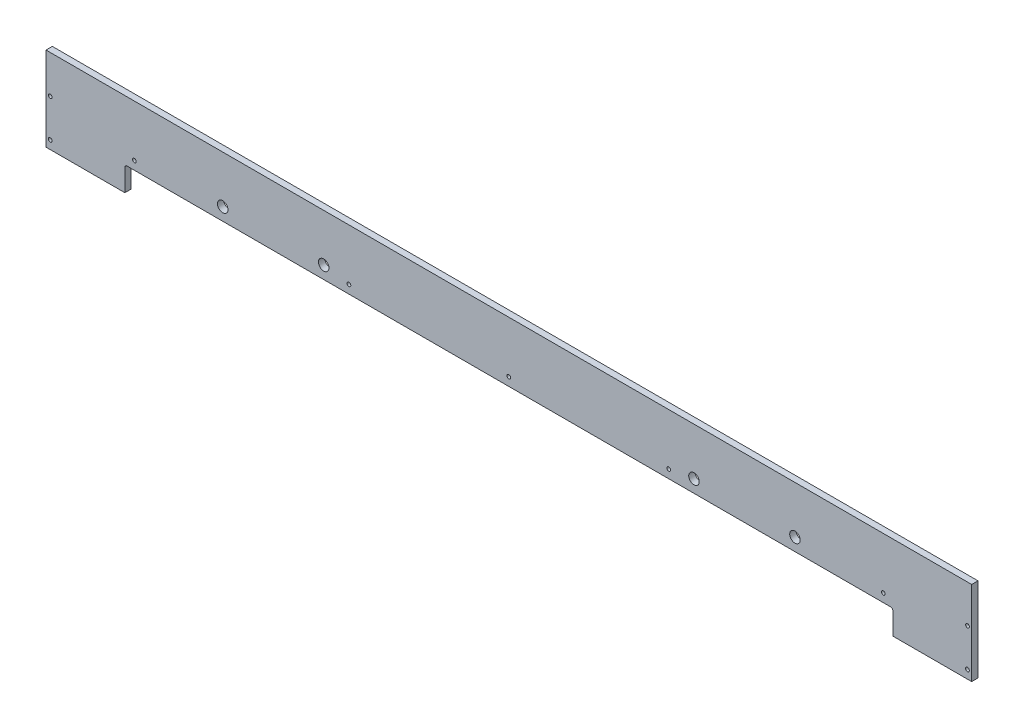
ISO-10303-21;
HEADER;
FILE_DESCRIPTION(('STEP AP214'),'2;1');
FILE_NAME('part.step','',(''),(''),'','','');
FILE_SCHEMA(('AUTOMOTIVE_DESIGN { 1 0 10303 214 1 1 1 1 }'));
ENDSEC;
DATA;
#1=APPLICATION_CONTEXT('core data for automotive mechanical design processes');
#2=APPLICATION_PROTOCOL_DEFINITION('international standard','automotive_design',2000,#1);
#3=PRODUCT_CONTEXT('',#1,'mechanical');
#4=PRODUCT('Part','Part','',(#3));
#5=PRODUCT_RELATED_PRODUCT_CATEGORY('part','',(#4));
#6=PRODUCT_DEFINITION_FORMATION('','',#4);
#7=PRODUCT_DEFINITION_CONTEXT('part definition',#1,'design');
#8=PRODUCT_DEFINITION('design','',#6,#7);
#9=PRODUCT_DEFINITION_SHAPE('','',#8);
#10=(LENGTH_UNIT() NAMED_UNIT(*) SI_UNIT(.MILLI.,.METRE.));
#11=(NAMED_UNIT(*) PLANE_ANGLE_UNIT() SI_UNIT($,.RADIAN.));
#12=(NAMED_UNIT(*) SI_UNIT($,.STERADIAN.) SOLID_ANGLE_UNIT());
#13=UNCERTAINTY_MEASURE_WITH_UNIT(LENGTH_MEASURE(1.E-05),#10,'distance_accuracy_value','');
#14=(GEOMETRIC_REPRESENTATION_CONTEXT(3) GLOBAL_UNCERTAINTY_ASSIGNED_CONTEXT((#13)) GLOBAL_UNIT_ASSIGNED_CONTEXT((#10,
#11,#12)) REPRESENTATION_CONTEXT('',''));
#15=CARTESIAN_POINT('',(0.,0.,0.));
#16=DIRECTION('',(0.,0.,1.));
#17=DIRECTION('',(1.,0.,0.));
#18=AXIS2_PLACEMENT_3D('',#15,#16,#17);
#19=CARTESIAN_POINT('',(-698.5,-63.5,-9.52500000000001));
#20=DIRECTION('',(0.,-1.,0.));
#21=DIRECTION('',(0.,0.,-1.));
#22=AXIS2_PLACEMENT_3D('',#19,#20,#21);
#23=PLANE('',#22);
#24=DIRECTION('',(0.,0.,1.));
#25=VECTOR('',#24,1.);
#26=CARTESIAN_POINT('',(-579.4375,-63.5000000000001,-9.52500000000001));
#27=LINE('',#26,#25);
#28=CARTESIAN_POINT('',(-579.4375,-63.5000000000001,-9.52500000000001));
#29=VERTEX_POINT('',#28);
#30=CARTESIAN_POINT('',(-579.4375,-63.5000000000001,0.));
#31=VERTEX_POINT('',#30);
#32=EDGE_CURVE('E122',#29,#31,#27,.T.);
#33=ORIENTED_EDGE('',*,*,#32,.T.);
#34=DIRECTION('',(1.,0.,0.));
#35=VECTOR('',#34,1.);
#36=CARTESIAN_POINT('',(-698.5,-63.5,0.));
#37=LINE('',#36,#35);
#38=CARTESIAN_POINT('',(-698.5,-63.5,0.));
#39=VERTEX_POINT('',#38);
#40=EDGE_CURVE('E161',#39,#31,#37,.T.);
#41=ORIENTED_EDGE('',*,*,#40,.F.);
#42=DIRECTION('',(0.,0.,1.));
#43=VECTOR('',#42,1.);
#44=CARTESIAN_POINT('',(-698.5,-63.5,-9.52500000000001));
#45=LINE('',#44,#43);
#46=CARTESIAN_POINT('',(-698.5,-63.5,-9.52500000000001));
#47=VERTEX_POINT('',#46);
#48=EDGE_CURVE('E43',#47,#39,#45,.T.);
#49=ORIENTED_EDGE('',*,*,#48,.F.);
#50=DIRECTION('',(1.,0.,0.));
#51=VECTOR('',#50,1.);
#52=CARTESIAN_POINT('',(-698.5,-63.5,-9.52500000000001));
#53=LINE('',#52,#51);
#54=EDGE_CURVE('E139',#47,#29,#53,.T.);
#55=ORIENTED_EDGE('',*,*,#54,.T.);
#56=EDGE_LOOP('',(#33,#41,#49,#55));
#57=FACE_BOUND('',#56,.T.);
#58=ADVANCED_FACE('F34',(#57),#23,.T.);
#59=CARTESIAN_POINT('',(698.5,63.5,-9.52500000000001));
#60=DIRECTION('',(1.,0.,0.));
#61=DIRECTION('',(0.,0.,-1.));
#62=AXIS2_PLACEMENT_3D('',#59,#60,#61);
#63=PLANE('',#62);
#64=DIRECTION('',(0.,1.,0.));
#65=VECTOR('',#64,1.);
#66=CARTESIAN_POINT('',(698.5,63.5,0.));
#67=LINE('',#66,#65);
#68=CARTESIAN_POINT('',(698.5,-63.5,0.));
#69=VERTEX_POINT('',#68);
#70=CARTESIAN_POINT('',(698.5,63.5,0.));
#71=VERTEX_POINT('',#70);
#72=EDGE_CURVE('E152',#69,#71,#67,.T.);
#73=ORIENTED_EDGE('',*,*,#72,.F.);
#74=DIRECTION('',(0.,0.,1.));
#75=VECTOR('',#74,1.);
#76=CARTESIAN_POINT('',(698.5,-63.5,-9.52500000000001));
#77=LINE('',#76,#75);
#78=CARTESIAN_POINT('',(698.5,-63.5,-9.52500000000001));
#79=VERTEX_POINT('',#78);
#80=EDGE_CURVE('E11',#79,#69,#77,.T.);
#81=ORIENTED_EDGE('',*,*,#80,.F.);
#82=DIRECTION('',(0.,1.,0.));
#83=VECTOR('',#82,1.);
#84=CARTESIAN_POINT('',(698.5,63.5,-9.52500000000001));
#85=LINE('',#84,#83);
#86=CARTESIAN_POINT('',(698.5,63.5,-9.52500000000001));
#87=VERTEX_POINT('',#86);
#88=EDGE_CURVE('E162',#79,#87,#85,.T.);
#89=ORIENTED_EDGE('',*,*,#88,.T.);
#90=DIRECTION('',(0.,0.,1.));
#91=VECTOR('',#90,1.);
#92=CARTESIAN_POINT('',(698.5,63.5,-9.52500000000001));
#93=LINE('',#92,#91);
#94=EDGE_CURVE('E38',#87,#71,#93,.T.);
#95=ORIENTED_EDGE('',*,*,#94,.T.);
#96=EDGE_LOOP('',(#73,#81,#89,#95));
#97=FACE_BOUND('',#96,.T.);
#98=ADVANCED_FACE('F36',(#97),#63,.T.);
#99=DIRECTION('',(0.,0.,1.));
#100=VECTOR('',#99,1.);
#101=CARTESIAN_POINT('',(579.4375,-63.5,-9.52500000000001));
#102=LINE('',#101,#100);
#103=CARTESIAN_POINT('',(579.4375,-63.5,-9.52500000000001));
#104=VERTEX_POINT('',#103);
#105=CARTESIAN_POINT('',(579.4375,-63.5,0.));
#106=VERTEX_POINT('',#105);
#107=EDGE_CURVE('E51',#104,#106,#102,.T.);
#108=ORIENTED_EDGE('',*,*,#107,.F.);
#109=EDGE_CURVE('E58',#104,#79,#53,.T.);
#110=ORIENTED_EDGE('',*,*,#109,.T.);
#111=ORIENTED_EDGE('',*,*,#80,.T.);
#112=EDGE_CURVE('E80',#106,#69,#37,.T.);
#113=ORIENTED_EDGE('',*,*,#112,.F.);
#114=EDGE_LOOP('',(#108,#110,#111,#113));
#115=FACE_BOUND('',#114,.T.);
#116=ADVANCED_FACE('F331',(#115),#23,.T.);
#117=CARTESIAN_POINT('',(-698.5,63.5,-9.52500000000001));
#118=DIRECTION('',(-1.,0.,0.));
#119=DIRECTION('',(0.,0.,1.));
#120=AXIS2_PLACEMENT_3D('',#117,#118,#119);
#121=PLANE('',#120);
#122=DIRECTION('',(0.,-1.,0.));
#123=VECTOR('',#122,1.);
#124=CARTESIAN_POINT('',(-698.5,63.5,0.));
#125=LINE('',#124,#123);
#126=CARTESIAN_POINT('',(-698.5,63.5,0.));
#127=VERTEX_POINT('',#126);
#128=EDGE_CURVE('E158',#127,#39,#125,.T.);
#129=ORIENTED_EDGE('',*,*,#128,.F.);
#130=DIRECTION('',(0.,0.,1.));
#131=VECTOR('',#130,1.);
#132=CARTESIAN_POINT('',(-698.5,63.5,-9.52500000000001));
#133=LINE('',#132,#131);
#134=CARTESIAN_POINT('',(-698.5,63.5,-9.52500000000001));
#135=VERTEX_POINT('',#134);
#136=EDGE_CURVE('E147',#135,#127,#133,.T.);
#137=ORIENTED_EDGE('',*,*,#136,.F.);
#138=DIRECTION('',(0.,-1.,0.));
#139=VECTOR('',#138,1.);
#140=CARTESIAN_POINT('',(-698.5,63.5,-9.52500000000001));
#141=LINE('',#140,#139);
#142=EDGE_CURVE('E148',#135,#47,#141,.T.);
#143=ORIENTED_EDGE('',*,*,#142,.T.);
#144=ORIENTED_EDGE('',*,*,#48,.T.);
#145=EDGE_LOOP('',(#129,#137,#143,#144));
#146=FACE_BOUND('',#145,.T.);
#147=ADVANCED_FACE('F168',(#146),#121,.T.);
#148=CARTESIAN_POINT('',(-698.5,63.5,-9.52500000000001));
#149=DIRECTION('',(0.,1.,0.));
#150=DIRECTION('',(0.,0.,1.));
#151=AXIS2_PLACEMENT_3D('',#148,#149,#150);
#152=PLANE('',#151);
#153=DIRECTION('',(-1.,0.,0.));
#154=VECTOR('',#153,1.);
#155=CARTESIAN_POINT('',(-698.5,63.5,0.));
#156=LINE('',#155,#154);
#157=EDGE_CURVE('E154',#71,#127,#156,.T.);
#158=ORIENTED_EDGE('',*,*,#157,.F.);
#159=ORIENTED_EDGE('',*,*,#94,.F.);
#160=DIRECTION('',(-1.,0.,0.));
#161=VECTOR('',#160,1.);
#162=CARTESIAN_POINT('',(-698.5,63.5,-9.52500000000001));
#163=LINE('',#162,#161);
#164=EDGE_CURVE('E166',#87,#135,#163,.T.);
#165=ORIENTED_EDGE('',*,*,#164,.T.);
#166=ORIENTED_EDGE('',*,*,#136,.T.);
#167=EDGE_LOOP('',(#158,#159,#165,#166));
#168=FACE_BOUND('',#167,.T.);
#169=ADVANCED_FACE('F165',(#168),#152,.T.);
#170=CARTESIAN_POINT('',(0.,0.,-9.52500000000001));
#171=DIRECTION('',(0.,0.,1.));
#172=DIRECTION('',(1.,0.,0.));
#173=AXIS2_PLACEMENT_3D('',#170,#171,#172);
#174=PLANE('',#173);
#175=CARTESIAN_POINT('',(431.8,-7.93749999999999,-9.52500000000001));
#176=DIRECTION('',(0.,0.,1.));
#177=DIRECTION('',(1.,0.,0.));
#178=AXIS2_PLACEMENT_3D('',#175,#176,#177);
#179=CIRCLE('',#178,7.93749999999998);
#180=CARTESIAN_POINT('',(439.7375,-7.93749999999999,-9.52500000000001));
#181=VERTEX_POINT('',#180);
#182=EDGE_CURVE('E275',#181,#181,#179,.F.);
#183=ORIENTED_EDGE('',*,*,#182,.F.);
#184=EDGE_LOOP('',(#183));
#185=FACE_BOUND('',#184,.T.);
#186=CARTESIAN_POINT('',(279.4,-7.93749999999999,-9.52500000000001));
#187=DIRECTION('',(0.,0.,1.));
#188=DIRECTION('',(1.,0.,0.));
#189=AXIS2_PLACEMENT_3D('',#186,#187,#188);
#190=CIRCLE('',#189,7.93749999999998);
#191=CARTESIAN_POINT('',(287.3375,-7.93749999999999,-9.52500000000001));
#192=VERTEX_POINT('',#191);
#193=EDGE_CURVE('E269',#192,#192,#190,.F.);
#194=ORIENTED_EDGE('',*,*,#193,.F.);
#195=EDGE_LOOP('',(#194));
#196=FACE_BOUND('',#195,.T.);
#197=CARTESIAN_POINT('',(-279.4,-7.93749999999999,-9.52500000000001));
#198=DIRECTION('',(0.,0.,1.));
#199=DIRECTION('',(1.,0.,0.));
#200=AXIS2_PLACEMENT_3D('',#197,#198,#199);
#201=CIRCLE('',#200,7.93749999999998);
#202=CARTESIAN_POINT('',(-271.4625,-7.93749999999999,-9.52500000000001));
#203=VERTEX_POINT('',#202);
#204=EDGE_CURVE('E263',#203,#203,#201,.F.);
#205=ORIENTED_EDGE('',*,*,#204,.F.);
#206=EDGE_LOOP('',(#205));
#207=FACE_BOUND('',#206,.T.);
#208=CARTESIAN_POINT('',(-431.8,-7.93749999999999,-9.52500000000001));
#209=DIRECTION('',(0.,0.,1.));
#210=DIRECTION('',(1.,0.,0.));
#211=AXIS2_PLACEMENT_3D('',#208,#209,#210);
#212=CIRCLE('',#211,7.93749999999998);
#213=CARTESIAN_POINT('',(-423.8625,-7.93749999999999,-9.52500000000001));
#214=VERTEX_POINT('',#213);
#215=EDGE_CURVE('E257',#214,#214,#212,.F.);
#216=ORIENTED_EDGE('',*,*,#215,.F.);
#217=EDGE_LOOP('',(#216));
#218=FACE_BOUND('',#217,.T.);
#219=CARTESIAN_POINT('',(-692.15,6.34999999999999,-9.52500000000001));
#220=DIRECTION('',(0.,0.,1.));
#221=DIRECTION('',(1.,0.,0.));
#222=AXIS2_PLACEMENT_3D('',#219,#220,#221);
#223=CIRCLE('',#222,2.8067);
#224=CARTESIAN_POINT('',(-689.3433,6.34999999999999,-9.52500000000001));
#225=VERTEX_POINT('',#224);
#226=EDGE_CURVE('E251',#225,#225,#223,.T.);
#227=ORIENTED_EDGE('',*,*,#226,.T.);
#228=EDGE_LOOP('',(#227));
#229=FACE_BOUND('',#228,.T.);
#230=CARTESIAN_POINT('',(-692.15,-50.8,-9.52500000000001));
#231=DIRECTION('',(0.,0.,1.));
#232=DIRECTION('',(1.,0.,0.));
#233=AXIS2_PLACEMENT_3D('',#230,#231,#232);
#234=CIRCLE('',#233,2.8067);
#235=CARTESIAN_POINT('',(-689.3433,-50.8,-9.52500000000001));
#236=VERTEX_POINT('',#235);
#237=EDGE_CURVE('E245',#236,#236,#234,.T.);
#238=ORIENTED_EDGE('',*,*,#237,.T.);
#239=EDGE_LOOP('',(#238));
#240=FACE_BOUND('',#239,.T.);
#241=CARTESIAN_POINT('',(692.15,6.34999999999999,-9.52500000000001));
#242=DIRECTION('',(0.,0.,1.));
#243=DIRECTION('',(1.,0.,0.));
#244=AXIS2_PLACEMENT_3D('',#241,#242,#243);
#245=CIRCLE('',#244,2.8067);
#246=CARTESIAN_POINT('',(694.9567,6.34999999999999,-9.52500000000001));
#247=VERTEX_POINT('',#246);
#248=EDGE_CURVE('E239',#247,#247,#245,.T.);
#249=ORIENTED_EDGE('',*,*,#248,.T.);
#250=EDGE_LOOP('',(#249));
#251=FACE_BOUND('',#250,.T.);
#252=CARTESIAN_POINT('',(692.15,-50.8,-9.52500000000001));
#253=DIRECTION('',(0.,0.,1.));
#254=DIRECTION('',(1.,0.,0.));
#255=AXIS2_PLACEMENT_3D('',#252,#253,#254);
#256=CIRCLE('',#255,2.8067);
#257=CARTESIAN_POINT('',(694.9567,-50.8,-9.52500000000001));
#258=VERTEX_POINT('',#257);
#259=EDGE_CURVE('E233',#258,#258,#256,.T.);
#260=ORIENTED_EDGE('',*,*,#259,.T.);
#261=EDGE_LOOP('',(#260));
#262=FACE_BOUND('',#261,.T.);
#263=CARTESIAN_POINT('',(-565.15,-14.2875,-9.52500000000001));
#264=DIRECTION('',(0.,0.,1.));
#265=DIRECTION('',(1.,0.,0.));
#266=AXIS2_PLACEMENT_3D('',#263,#264,#265);
#267=CIRCLE('',#266,2.8067);
#268=CARTESIAN_POINT('',(-562.3433,-14.2875,-9.52500000000001));
#269=VERTEX_POINT('',#268);
#270=EDGE_CURVE('E227',#269,#269,#267,.T.);
#271=ORIENTED_EDGE('',*,*,#270,.T.);
#272=EDGE_LOOP('',(#271));
#273=FACE_BOUND('',#272,.T.);
#274=CARTESIAN_POINT('',(-241.3,-14.2875,-9.52500000000001));
#275=DIRECTION('',(0.,0.,1.));
#276=DIRECTION('',(1.,0.,0.));
#277=AXIS2_PLACEMENT_3D('',#274,#275,#276);
#278=CIRCLE('',#277,2.8067);
#279=CARTESIAN_POINT('',(-238.4933,-14.2875,-9.52500000000001));
#280=VERTEX_POINT('',#279);
#281=EDGE_CURVE('E221',#280,#280,#278,.T.);
#282=ORIENTED_EDGE('',*,*,#281,.T.);
#283=EDGE_LOOP('',(#282));
#284=FACE_BOUND('',#283,.T.);
#285=CARTESIAN_POINT('',(0.,-14.2875,-9.52500000000001));
#286=DIRECTION('',(0.,0.,1.));
#287=DIRECTION('',(1.,0.,0.));
#288=AXIS2_PLACEMENT_3D('',#285,#286,#287);
#289=CIRCLE('',#288,2.80669999999999);
#290=CARTESIAN_POINT('',(2.80669999999999,-14.2875,-9.52500000000001));
#291=VERTEX_POINT('',#290);
#292=EDGE_CURVE('E215',#291,#291,#289,.T.);
#293=ORIENTED_EDGE('',*,*,#292,.T.);
#294=EDGE_LOOP('',(#293));
#295=FACE_BOUND('',#294,.T.);
#296=CARTESIAN_POINT('',(241.3,-14.2875,-9.52500000000001));
#297=DIRECTION('',(0.,0.,1.));
#298=DIRECTION('',(1.,0.,0.));
#299=AXIS2_PLACEMENT_3D('',#296,#297,#298);
#300=CIRCLE('',#299,2.8067);
#301=CARTESIAN_POINT('',(244.1067,-14.2875,-9.52500000000001));
#302=VERTEX_POINT('',#301);
#303=EDGE_CURVE('E209',#302,#302,#300,.T.);
#304=ORIENTED_EDGE('',*,*,#303,.T.);
#305=EDGE_LOOP('',(#304));
#306=FACE_BOUND('',#305,.T.);
#307=CARTESIAN_POINT('',(565.15,-14.2875,-9.52500000000001));
#308=DIRECTION('',(0.,0.,1.));
#309=DIRECTION('',(1.,0.,0.));
#310=AXIS2_PLACEMENT_3D('',#307,#308,#309);
#311=CIRCLE('',#310,2.8067);
#312=CARTESIAN_POINT('',(567.9567,-14.2875,-9.52500000000001));
#313=VERTEX_POINT('',#312);
#314=EDGE_CURVE('E195',#313,#313,#311,.T.);
#315=ORIENTED_EDGE('',*,*,#314,.T.);
#316=EDGE_LOOP('',(#315));
#317=FACE_BOUND('',#316,.T.);
#318=CARTESIAN_POINT('',(-576.2625,-30.1625000000001,-9.52500000000001));
#319=DIRECTION('',(0.,0.,1.));
#320=DIRECTION('',(-1.,0.,0.));
#321=AXIS2_PLACEMENT_3D('',#318,#319,#320);
#322=CIRCLE('',#321,3.17500000000004);
#323=CARTESIAN_POINT('',(-576.2625,-26.9875,-9.52500000000001));
#324=VERTEX_POINT('',#323);
#325=CARTESIAN_POINT('',(-579.4375,-30.1625000000001,-9.52500000000001));
#326=VERTEX_POINT('',#325);
#327=EDGE_CURVE('E133',#324,#326,#322,.T.);
#328=ORIENTED_EDGE('',*,*,#327,.T.);
#329=DIRECTION('',(0.,-1.,0.));
#330=VECTOR('',#329,1.);
#331=CARTESIAN_POINT('',(-579.4375,-63.5000000000001,-9.52500000000001));
#332=LINE('',#331,#330);
#333=EDGE_CURVE('E125',#326,#29,#332,.T.);
#334=ORIENTED_EDGE('',*,*,#333,.T.);
#335=ORIENTED_EDGE('',*,*,#54,.F.);
#336=ORIENTED_EDGE('',*,*,#142,.F.);
#337=ORIENTED_EDGE('',*,*,#164,.F.);
#338=ORIENTED_EDGE('',*,*,#88,.F.);
#339=ORIENTED_EDGE('',*,*,#109,.F.);
#340=DIRECTION('',(0.,1.,0.));
#341=VECTOR('',#340,1.);
#342=CARTESIAN_POINT('',(579.4375,-63.5,-9.52500000000001));
#343=LINE('',#342,#341);
#344=CARTESIAN_POINT('',(579.4375,-30.1625,-9.52500000000001));
#345=VERTEX_POINT('',#344);
#346=EDGE_CURVE('E142',#104,#345,#343,.T.);
#347=ORIENTED_EDGE('',*,*,#346,.T.);
#348=CARTESIAN_POINT('',(576.2625,-30.1625,-9.52500000000001));
#349=DIRECTION('',(0.,0.,1.));
#350=DIRECTION('',(-1.,0.,0.));
#351=AXIS2_PLACEMENT_3D('',#348,#349,#350);
#352=CIRCLE('',#351,3.17500000000004);
#353=CARTESIAN_POINT('',(576.2625,-26.9875,-9.52500000000001));
#354=VERTEX_POINT('',#353);
#355=EDGE_CURVE('E199',#345,#354,#352,.T.);
#356=ORIENTED_EDGE('',*,*,#355,.T.);
#357=DIRECTION('',(-1.,0.,0.));
#358=VECTOR('',#357,1.);
#359=CARTESIAN_POINT('',(-576.2625,-26.9875,-9.52500000000001));
#360=LINE('',#359,#358);
#361=EDGE_CURVE('E197',#354,#324,#360,.T.);
#362=ORIENTED_EDGE('',*,*,#361,.T.);
#363=EDGE_LOOP('',(#328,#334,#335,#336,#337,#338,#339,#347,#356,#362));
#364=FACE_BOUND('',#363,.T.);
#365=ADVANCED_FACE('F137',(#185,#196,#207,#218,#229,#240,#251,#262,#273,#284,#295,#306,#317,
#364),#174,.F.);
#366=CARTESIAN_POINT('',(0.,0.,0.));
#367=DIRECTION('',(0.,0.,1.));
#368=DIRECTION('',(1.,0.,0.));
#369=AXIS2_PLACEMENT_3D('',#366,#367,#368);
#370=PLANE('',#369);
#371=CARTESIAN_POINT('',(431.8,-7.93749999999999,0.));
#372=DIRECTION('',(0.,0.,1.));
#373=DIRECTION('',(1.,0.,0.));
#374=AXIS2_PLACEMENT_3D('',#371,#372,#373);
#375=CIRCLE('',#374,7.93749999999998);
#376=CARTESIAN_POINT('',(439.7375,-7.93749999999999,0.));
#377=VERTEX_POINT('',#376);
#378=EDGE_CURVE('E278',#377,#377,#375,.T.);
#379=ORIENTED_EDGE('',*,*,#378,.F.);
#380=EDGE_LOOP('',(#379));
#381=FACE_BOUND('',#380,.T.);
#382=CARTESIAN_POINT('',(279.4,-7.93749999999999,0.));
#383=DIRECTION('',(0.,0.,1.));
#384=DIRECTION('',(1.,0.,0.));
#385=AXIS2_PLACEMENT_3D('',#382,#383,#384);
#386=CIRCLE('',#385,7.93749999999998);
#387=CARTESIAN_POINT('',(287.3375,-7.93749999999999,0.));
#388=VERTEX_POINT('',#387);
#389=EDGE_CURVE('E272',#388,#388,#386,.T.);
#390=ORIENTED_EDGE('',*,*,#389,.F.);
#391=EDGE_LOOP('',(#390));
#392=FACE_BOUND('',#391,.T.);
#393=CARTESIAN_POINT('',(-279.4,-7.93749999999999,0.));
#394=DIRECTION('',(0.,0.,1.));
#395=DIRECTION('',(1.,0.,0.));
#396=AXIS2_PLACEMENT_3D('',#393,#394,#395);
#397=CIRCLE('',#396,7.93749999999998);
#398=CARTESIAN_POINT('',(-271.4625,-7.93749999999999,0.));
#399=VERTEX_POINT('',#398);
#400=EDGE_CURVE('E266',#399,#399,#397,.T.);
#401=ORIENTED_EDGE('',*,*,#400,.F.);
#402=EDGE_LOOP('',(#401));
#403=FACE_BOUND('',#402,.T.);
#404=CARTESIAN_POINT('',(-431.8,-7.93749999999999,0.));
#405=DIRECTION('',(0.,0.,1.));
#406=DIRECTION('',(1.,0.,0.));
#407=AXIS2_PLACEMENT_3D('',#404,#405,#406);
#408=CIRCLE('',#407,7.93749999999998);
#409=CARTESIAN_POINT('',(-423.8625,-7.93749999999999,0.));
#410=VERTEX_POINT('',#409);
#411=EDGE_CURVE('E260',#410,#410,#408,.T.);
#412=ORIENTED_EDGE('',*,*,#411,.F.);
#413=EDGE_LOOP('',(#412));
#414=FACE_BOUND('',#413,.T.);
#415=CARTESIAN_POINT('',(-692.15,6.34999999999999,0.));
#416=DIRECTION('',(0.,0.,1.));
#417=DIRECTION('',(1.,0.,0.));
#418=AXIS2_PLACEMENT_3D('',#415,#416,#417);
#419=CIRCLE('',#418,2.80669999999994);
#420=CARTESIAN_POINT('',(-689.3433,6.34999999999999,0.));
#421=VERTEX_POINT('',#420);
#422=EDGE_CURVE('E254',#421,#421,#419,.T.);
#423=ORIENTED_EDGE('',*,*,#422,.F.);
#424=EDGE_LOOP('',(#423));
#425=FACE_BOUND('',#424,.T.);
#426=CARTESIAN_POINT('',(-692.15,-50.8,0.));
#427=DIRECTION('',(0.,0.,1.));
#428=DIRECTION('',(1.,0.,0.));
#429=AXIS2_PLACEMENT_3D('',#426,#427,#428);
#430=CIRCLE('',#429,2.80669999999994);
#431=CARTESIAN_POINT('',(-689.3433,-50.8,0.));
#432=VERTEX_POINT('',#431);
#433=EDGE_CURVE('E248',#432,#432,#430,.T.);
#434=ORIENTED_EDGE('',*,*,#433,.F.);
#435=EDGE_LOOP('',(#434));
#436=FACE_BOUND('',#435,.T.);
#437=CARTESIAN_POINT('',(692.15,6.34999999999999,0.));
#438=DIRECTION('',(0.,0.,1.));
#439=DIRECTION('',(1.,0.,0.));
#440=AXIS2_PLACEMENT_3D('',#437,#438,#439);
#441=CIRCLE('',#440,2.80669999999994);
#442=CARTESIAN_POINT('',(694.9567,6.34999999999999,0.));
#443=VERTEX_POINT('',#442);
#444=EDGE_CURVE('E242',#443,#443,#441,.T.);
#445=ORIENTED_EDGE('',*,*,#444,.F.);
#446=EDGE_LOOP('',(#445));
#447=FACE_BOUND('',#446,.T.);
#448=CARTESIAN_POINT('',(692.15,-50.8,0.));
#449=DIRECTION('',(0.,0.,1.));
#450=DIRECTION('',(1.,0.,0.));
#451=AXIS2_PLACEMENT_3D('',#448,#449,#450);
#452=CIRCLE('',#451,2.80669999999994);
#453=CARTESIAN_POINT('',(694.9567,-50.8,0.));
#454=VERTEX_POINT('',#453);
#455=EDGE_CURVE('E236',#454,#454,#452,.T.);
#456=ORIENTED_EDGE('',*,*,#455,.F.);
#457=EDGE_LOOP('',(#456));
#458=FACE_BOUND('',#457,.T.);
#459=CARTESIAN_POINT('',(-565.15,-14.2875,0.));
#460=DIRECTION('',(0.,0.,1.));
#461=DIRECTION('',(1.,0.,0.));
#462=AXIS2_PLACEMENT_3D('',#459,#460,#461);
#463=CIRCLE('',#462,2.80669999999994);
#464=CARTESIAN_POINT('',(-562.3433,-14.2875,0.));
#465=VERTEX_POINT('',#464);
#466=EDGE_CURVE('E230',#465,#465,#463,.T.);
#467=ORIENTED_EDGE('',*,*,#466,.F.);
#468=EDGE_LOOP('',(#467));
#469=FACE_BOUND('',#468,.T.);
#470=CARTESIAN_POINT('',(-241.3,-14.2875,0.));
#471=DIRECTION('',(0.,0.,1.));
#472=DIRECTION('',(1.,0.,0.));
#473=AXIS2_PLACEMENT_3D('',#470,#471,#472);
#474=CIRCLE('',#473,2.8067);
#475=CARTESIAN_POINT('',(-238.4933,-14.2875,0.));
#476=VERTEX_POINT('',#475);
#477=EDGE_CURVE('E224',#476,#476,#474,.T.);
#478=ORIENTED_EDGE('',*,*,#477,.F.);
#479=EDGE_LOOP('',(#478));
#480=FACE_BOUND('',#479,.T.);
#481=CARTESIAN_POINT('',(0.,-14.2875,0.));
#482=DIRECTION('',(0.,0.,1.));
#483=DIRECTION('',(1.,0.,0.));
#484=AXIS2_PLACEMENT_3D('',#481,#482,#483);
#485=CIRCLE('',#484,2.80669999999999);
#486=CARTESIAN_POINT('',(2.80669999999999,-14.2875,0.));
#487=VERTEX_POINT('',#486);
#488=EDGE_CURVE('E218',#487,#487,#485,.T.);
#489=ORIENTED_EDGE('',*,*,#488,.F.);
#490=EDGE_LOOP('',(#489));
#491=FACE_BOUND('',#490,.T.);
#492=CARTESIAN_POINT('',(241.3,-14.2875,0.));
#493=DIRECTION('',(0.,0.,1.));
#494=DIRECTION('',(1.,0.,0.));
#495=AXIS2_PLACEMENT_3D('',#492,#493,#494);
#496=CIRCLE('',#495,2.8067);
#497=CARTESIAN_POINT('',(244.1067,-14.2875,0.));
#498=VERTEX_POINT('',#497);
#499=EDGE_CURVE('E212',#498,#498,#496,.T.);
#500=ORIENTED_EDGE('',*,*,#499,.F.);
#501=EDGE_LOOP('',(#500));
#502=FACE_BOUND('',#501,.T.);
#503=CARTESIAN_POINT('',(565.15,-14.2875,0.));
#504=DIRECTION('',(0.,0.,1.));
#505=DIRECTION('',(1.,0.,0.));
#506=AXIS2_PLACEMENT_3D('',#503,#504,#505);
#507=CIRCLE('',#506,2.80669999999994);
#508=CARTESIAN_POINT('',(567.9567,-14.2875,0.));
#509=VERTEX_POINT('',#508);
#510=EDGE_CURVE('E206',#509,#509,#507,.T.);
#511=ORIENTED_EDGE('',*,*,#510,.F.);
#512=EDGE_LOOP('',(#511));
#513=FACE_BOUND('',#512,.T.);
#514=DIRECTION('',(0.,-1.,0.));
#515=VECTOR('',#514,1.);
#516=CARTESIAN_POINT('',(-579.4375,-63.5000000000001,0.));
#517=LINE('',#516,#515);
#518=CARTESIAN_POINT('',(-579.4375,-30.1625000000001,0.));
#519=VERTEX_POINT('',#518);
#520=EDGE_CURVE('E128',#519,#31,#517,.T.);
#521=ORIENTED_EDGE('',*,*,#520,.F.);
#522=CARTESIAN_POINT('',(-576.2625,-30.1625000000001,0.));
#523=DIRECTION('',(0.,0.,1.));
#524=DIRECTION('',(-1.,0.,0.));
#525=AXIS2_PLACEMENT_3D('',#522,#523,#524);
#526=CIRCLE('',#525,3.17500000000004);
#527=CARTESIAN_POINT('',(-576.2625,-26.9875,0.));
#528=VERTEX_POINT('',#527);
#529=EDGE_CURVE('E143',#528,#519,#526,.T.);
#530=ORIENTED_EDGE('',*,*,#529,.F.);
#531=DIRECTION('',(-1.,0.,0.));
#532=VECTOR('',#531,1.);
#533=CARTESIAN_POINT('',(-576.2625,-26.9875,0.));
#534=LINE('',#533,#532);
#535=CARTESIAN_POINT('',(576.2625,-26.9875,0.));
#536=VERTEX_POINT('',#535);
#537=EDGE_CURVE('E186',#536,#528,#534,.T.);
#538=ORIENTED_EDGE('',*,*,#537,.F.);
#539=CARTESIAN_POINT('',(576.2625,-30.1625,0.));
#540=DIRECTION('',(0.,0.,1.));
#541=DIRECTION('',(-1.,0.,0.));
#542=AXIS2_PLACEMENT_3D('',#539,#540,#541);
#543=CIRCLE('',#542,3.17500000000004);
#544=CARTESIAN_POINT('',(579.4375,-30.1625,0.));
#545=VERTEX_POINT('',#544);
#546=EDGE_CURVE('E189',#545,#536,#543,.T.);
#547=ORIENTED_EDGE('',*,*,#546,.F.);
#548=DIRECTION('',(0.,1.,0.));
#549=VECTOR('',#548,1.);
#550=CARTESIAN_POINT('',(579.4375,-63.5,0.));
#551=LINE('',#550,#549);
#552=EDGE_CURVE('E192',#106,#545,#551,.T.);
#553=ORIENTED_EDGE('',*,*,#552,.F.);
#554=ORIENTED_EDGE('',*,*,#112,.T.);
#555=ORIENTED_EDGE('',*,*,#72,.T.);
#556=ORIENTED_EDGE('',*,*,#157,.T.);
#557=ORIENTED_EDGE('',*,*,#128,.T.);
#558=ORIENTED_EDGE('',*,*,#40,.T.);
#559=EDGE_LOOP('',(#521,#530,#538,#547,#553,#554,#555,#556,#557,#558));
#560=FACE_BOUND('',#559,.T.);
#561=ADVANCED_FACE('F169',(#381,#392,#403,#414,#425,#436,#447,#458,#469,#480,#491,#502,#513,
#560),#370,.T.);
#562=CARTESIAN_POINT('',(-579.4375,-63.5000000000001,-9.52500000000001));
#563=DIRECTION('',(-1.,0.,0.));
#564=DIRECTION('',(0.,-1.,0.));
#565=AXIS2_PLACEMENT_3D('',#562,#563,#564);
#566=PLANE('',#565);
#567=ORIENTED_EDGE('',*,*,#520,.T.);
#568=ORIENTED_EDGE('',*,*,#32,.F.);
#569=ORIENTED_EDGE('',*,*,#333,.F.);
#570=DIRECTION('',(0.,0.,1.));
#571=VECTOR('',#570,1.);
#572=CARTESIAN_POINT('',(-579.4375,-30.1625000000001,-9.52500000000001));
#573=LINE('',#572,#571);
#574=EDGE_CURVE('E155',#326,#519,#573,.T.);
#575=ORIENTED_EDGE('',*,*,#574,.T.);
#576=EDGE_LOOP('',(#567,#568,#569,#575));
#577=FACE_BOUND('',#576,.T.);
#578=ADVANCED_FACE('F124',(#577),#566,.F.);
#579=CARTESIAN_POINT('',(-576.2625,-30.1625000000001,-9.52500000000001));
#580=DIRECTION('',(0.,0.,1.));
#581=DIRECTION('',(1.,0.,0.));
#582=AXIS2_PLACEMENT_3D('',#579,#580,#581);
#583=CYLINDRICAL_SURFACE('',#582,3.17500000000004);
#584=ORIENTED_EDGE('',*,*,#529,.T.);
#585=ORIENTED_EDGE('',*,*,#574,.F.);
#586=ORIENTED_EDGE('',*,*,#327,.F.);
#587=DIRECTION('',(0.,0.,1.));
#588=VECTOR('',#587,1.);
#589=CARTESIAN_POINT('',(-576.2625,-26.9875,-9.52500000000001));
#590=LINE('',#589,#588);
#591=EDGE_CURVE('E181',#324,#528,#590,.T.);
#592=ORIENTED_EDGE('',*,*,#591,.T.);
#593=EDGE_LOOP('',(#584,#585,#586,#592));
#594=FACE_BOUND('',#593,.T.);
#595=ADVANCED_FACE('F349',(#594),#583,.F.);
#596=CARTESIAN_POINT('',(-576.2625,-26.9875,-9.52500000000001));
#597=DIRECTION('',(0.,1.,0.));
#598=DIRECTION('',(-1.,0.,0.));
#599=AXIS2_PLACEMENT_3D('',#596,#597,#598);
#600=PLANE('',#599);
#601=ORIENTED_EDGE('',*,*,#537,.T.);
#602=ORIENTED_EDGE('',*,*,#591,.F.);
#603=ORIENTED_EDGE('',*,*,#361,.F.);
#604=DIRECTION('',(0.,0.,1.));
#605=VECTOR('',#604,1.);
#606=CARTESIAN_POINT('',(576.2625,-26.9875,-9.52500000000001));
#607=LINE('',#606,#605);
#608=EDGE_CURVE('E179',#354,#536,#607,.T.);
#609=ORIENTED_EDGE('',*,*,#608,.T.);
#610=EDGE_LOOP('',(#601,#602,#603,#609));
#611=FACE_BOUND('',#610,.T.);
#612=ADVANCED_FACE('F346',(#611),#600,.F.);
#613=CARTESIAN_POINT('',(576.2625,-30.1625,-9.52500000000001));
#614=DIRECTION('',(0.,0.,1.));
#615=DIRECTION('',(1.,0.,0.));
#616=AXIS2_PLACEMENT_3D('',#613,#614,#615);
#617=CYLINDRICAL_SURFACE('',#616,3.17500000000004);
#618=ORIENTED_EDGE('',*,*,#546,.T.);
#619=ORIENTED_EDGE('',*,*,#608,.F.);
#620=ORIENTED_EDGE('',*,*,#355,.F.);
#621=DIRECTION('',(0.,0.,1.));
#622=VECTOR('',#621,1.);
#623=CARTESIAN_POINT('',(579.4375,-30.1625,-9.52500000000001));
#624=LINE('',#623,#622);
#625=EDGE_CURVE('E177',#345,#545,#624,.T.);
#626=ORIENTED_EDGE('',*,*,#625,.T.);
#627=EDGE_LOOP('',(#618,#619,#620,#626));
#628=FACE_BOUND('',#627,.T.);
#629=ADVANCED_FACE('F325',(#628),#617,.F.);
#630=CARTESIAN_POINT('',(579.4375,-63.5,-9.52500000000001));
#631=DIRECTION('',(1.,0.,0.));
#632=DIRECTION('',(0.,1.,0.));
#633=AXIS2_PLACEMENT_3D('',#630,#631,#632);
#634=PLANE('',#633);
#635=ORIENTED_EDGE('',*,*,#552,.T.);
#636=ORIENTED_EDGE('',*,*,#625,.F.);
#637=ORIENTED_EDGE('',*,*,#346,.F.);
#638=ORIENTED_EDGE('',*,*,#107,.T.);
#639=EDGE_LOOP('',(#635,#636,#637,#638));
#640=FACE_BOUND('',#639,.T.);
#641=ADVANCED_FACE('F315',(#640),#634,.F.);
#642=CARTESIAN_POINT('',(565.15,-14.2875,0.));
#643=DIRECTION('',(0.,0.,1.));
#644=DIRECTION('',(1.,0.,0.));
#645=AXIS2_PLACEMENT_3D('',#642,#643,#644);
#646=CYLINDRICAL_SURFACE('',#645,2.8067);
#647=ORIENTED_EDGE('',*,*,#314,.F.);
#648=EDGE_LOOP('',(#647));
#649=FACE_BOUND('',#648,.T.);
#650=ORIENTED_EDGE('',*,*,#510,.T.);
#651=EDGE_LOOP('',(#650));
#652=FACE_BOUND('',#651,.T.);
#653=ADVANCED_FACE('F312',(#649,#652),#646,.F.);
#654=CARTESIAN_POINT('',(241.3,-14.2875,0.));
#655=DIRECTION('',(0.,0.,1.));
#656=DIRECTION('',(1.,0.,0.));
#657=AXIS2_PLACEMENT_3D('',#654,#655,#656);
#658=CYLINDRICAL_SURFACE('',#657,2.8067);
#659=ORIENTED_EDGE('',*,*,#303,.F.);
#660=EDGE_LOOP('',(#659));
#661=FACE_BOUND('',#660,.T.);
#662=ORIENTED_EDGE('',*,*,#499,.T.);
#663=EDGE_LOOP('',(#662));
#664=FACE_BOUND('',#663,.T.);
#665=ADVANCED_FACE('F314',(#661,#664),#658,.F.);
#666=CARTESIAN_POINT('',(0.,-14.2875,0.));
#667=DIRECTION('',(0.,0.,1.));
#668=DIRECTION('',(1.,0.,0.));
#669=AXIS2_PLACEMENT_3D('',#666,#667,#668);
#670=CYLINDRICAL_SURFACE('',#669,2.80669999999999);
#671=ORIENTED_EDGE('',*,*,#292,.F.);
#672=EDGE_LOOP('',(#671));
#673=FACE_BOUND('',#672,.T.);
#674=ORIENTED_EDGE('',*,*,#488,.T.);
#675=EDGE_LOOP('',(#674));
#676=FACE_BOUND('',#675,.T.);
#677=ADVANCED_FACE('F322',(#673,#676),#670,.F.);
#678=CARTESIAN_POINT('',(-241.3,-14.2875,0.));
#679=DIRECTION('',(0.,0.,1.));
#680=DIRECTION('',(1.,0.,0.));
#681=AXIS2_PLACEMENT_3D('',#678,#679,#680);
#682=CYLINDRICAL_SURFACE('',#681,2.8067);
#683=ORIENTED_EDGE('',*,*,#281,.F.);
#684=EDGE_LOOP('',(#683));
#685=FACE_BOUND('',#684,.T.);
#686=ORIENTED_EDGE('',*,*,#477,.T.);
#687=EDGE_LOOP('',(#686));
#688=FACE_BOUND('',#687,.T.);
#689=ADVANCED_FACE('F393',(#685,#688),#682,.F.);
#690=CARTESIAN_POINT('',(-565.15,-14.2875,0.));
#691=DIRECTION('',(0.,0.,1.));
#692=DIRECTION('',(1.,0.,0.));
#693=AXIS2_PLACEMENT_3D('',#690,#691,#692);
#694=CYLINDRICAL_SURFACE('',#693,2.8067);
#695=ORIENTED_EDGE('',*,*,#270,.F.);
#696=EDGE_LOOP('',(#695));
#697=FACE_BOUND('',#696,.T.);
#698=ORIENTED_EDGE('',*,*,#466,.T.);
#699=EDGE_LOOP('',(#698));
#700=FACE_BOUND('',#699,.T.);
#701=ADVANCED_FACE('F398',(#697,#700),#694,.F.);
#702=CARTESIAN_POINT('',(692.15,-50.8,0.));
#703=DIRECTION('',(0.,0.,1.));
#704=DIRECTION('',(1.,0.,0.));
#705=AXIS2_PLACEMENT_3D('',#702,#703,#704);
#706=CYLINDRICAL_SURFACE('',#705,2.8067);
#707=ORIENTED_EDGE('',*,*,#259,.F.);
#708=EDGE_LOOP('',(#707));
#709=FACE_BOUND('',#708,.T.);
#710=ORIENTED_EDGE('',*,*,#455,.T.);
#711=EDGE_LOOP('',(#710));
#712=FACE_BOUND('',#711,.T.);
#713=ADVANCED_FACE('F404',(#709,#712),#706,.F.);
#714=CARTESIAN_POINT('',(692.15,6.34999999999999,0.));
#715=DIRECTION('',(0.,0.,1.));
#716=DIRECTION('',(1.,0.,0.));
#717=AXIS2_PLACEMENT_3D('',#714,#715,#716);
#718=CYLINDRICAL_SURFACE('',#717,2.8067);
#719=ORIENTED_EDGE('',*,*,#248,.F.);
#720=EDGE_LOOP('',(#719));
#721=FACE_BOUND('',#720,.T.);
#722=ORIENTED_EDGE('',*,*,#444,.T.);
#723=EDGE_LOOP('',(#722));
#724=FACE_BOUND('',#723,.T.);
#725=ADVANCED_FACE('F408',(#721,#724),#718,.F.);
#726=CARTESIAN_POINT('',(-692.15,-50.8,0.));
#727=DIRECTION('',(0.,0.,1.));
#728=DIRECTION('',(1.,0.,0.));
#729=AXIS2_PLACEMENT_3D('',#726,#727,#728);
#730=CYLINDRICAL_SURFACE('',#729,2.8067);
#731=ORIENTED_EDGE('',*,*,#237,.F.);
#732=EDGE_LOOP('',(#731));
#733=FACE_BOUND('',#732,.T.);
#734=ORIENTED_EDGE('',*,*,#433,.T.);
#735=EDGE_LOOP('',(#734));
#736=FACE_BOUND('',#735,.T.);
#737=ADVANCED_FACE('F412',(#733,#736),#730,.F.);
#738=CARTESIAN_POINT('',(-692.15,6.34999999999999,0.));
#739=DIRECTION('',(0.,0.,1.));
#740=DIRECTION('',(1.,0.,0.));
#741=AXIS2_PLACEMENT_3D('',#738,#739,#740);
#742=CYLINDRICAL_SURFACE('',#741,2.8067);
#743=ORIENTED_EDGE('',*,*,#226,.F.);
#744=EDGE_LOOP('',(#743));
#745=FACE_BOUND('',#744,.T.);
#746=ORIENTED_EDGE('',*,*,#422,.T.);
#747=EDGE_LOOP('',(#746));
#748=FACE_BOUND('',#747,.T.);
#749=ADVANCED_FACE('F416',(#745,#748),#742,.F.);
#750=CARTESIAN_POINT('',(-431.8,-7.93749999999999,-9.52599999999998));
#751=DIRECTION('',(0.,0.,1.));
#752=DIRECTION('',(1.,0.,0.));
#753=AXIS2_PLACEMENT_3D('',#750,#751,#752);
#754=CYLINDRICAL_SURFACE('',#753,7.93749999999998);
#755=ORIENTED_EDGE('',*,*,#411,.T.);
#756=EDGE_LOOP('',(#755));
#757=FACE_BOUND('',#756,.T.);
#758=ORIENTED_EDGE('',*,*,#215,.T.);
#759=EDGE_LOOP('',(#758));
#760=FACE_BOUND('',#759,.T.);
#761=ADVANCED_FACE('F420',(#757,#760),#754,.F.);
#762=CARTESIAN_POINT('',(-279.4,-7.93749999999999,-9.52599999999998));
#763=DIRECTION('',(0.,0.,1.));
#764=DIRECTION('',(1.,0.,0.));
#765=AXIS2_PLACEMENT_3D('',#762,#763,#764);
#766=CYLINDRICAL_SURFACE('',#765,7.93749999999998);
#767=ORIENTED_EDGE('',*,*,#400,.T.);
#768=EDGE_LOOP('',(#767));
#769=FACE_BOUND('',#768,.T.);
#770=ORIENTED_EDGE('',*,*,#204,.T.);
#771=EDGE_LOOP('',(#770));
#772=FACE_BOUND('',#771,.T.);
#773=ADVANCED_FACE('F424',(#769,#772),#766,.F.);
#774=CARTESIAN_POINT('',(279.4,-7.93749999999999,-9.52599999999998));
#775=DIRECTION('',(0.,0.,1.));
#776=DIRECTION('',(1.,0.,0.));
#777=AXIS2_PLACEMENT_3D('',#774,#775,#776);
#778=CYLINDRICAL_SURFACE('',#777,7.93749999999998);
#779=ORIENTED_EDGE('',*,*,#389,.T.);
#780=EDGE_LOOP('',(#779));
#781=FACE_BOUND('',#780,.T.);
#782=ORIENTED_EDGE('',*,*,#193,.T.);
#783=EDGE_LOOP('',(#782));
#784=FACE_BOUND('',#783,.T.);
#785=ADVANCED_FACE('F428',(#781,#784),#778,.F.);
#786=CARTESIAN_POINT('',(431.8,-7.93749999999999,-9.52599999999998));
#787=DIRECTION('',(0.,0.,1.));
#788=DIRECTION('',(1.,0.,0.));
#789=AXIS2_PLACEMENT_3D('',#786,#787,#788);
#790=CYLINDRICAL_SURFACE('',#789,7.93749999999998);
#791=ORIENTED_EDGE('',*,*,#378,.T.);
#792=EDGE_LOOP('',(#791));
#793=FACE_BOUND('',#792,.T.);
#794=ORIENTED_EDGE('',*,*,#182,.T.);
#795=EDGE_LOOP('',(#794));
#796=FACE_BOUND('',#795,.T.);
#797=ADVANCED_FACE('F282',(#793,#796),#790,.F.);
#798=CLOSED_SHELL('',(#58,#98,#116,#147,#169,#365,#561,#578,#595,#612,#629,#641,#653,#665,#677,
#689,#701,#713,#725,#737,#749,#761,#773,#785,#797));
#799=MANIFOLD_SOLID_BREP('B2',#798);
#800=ADVANCED_BREP_SHAPE_REPRESENTATION('',(#18,#799),#14);
#801=SHAPE_DEFINITION_REPRESENTATION(#9,#800);
ENDSEC;
END-ISO-10303-21;
